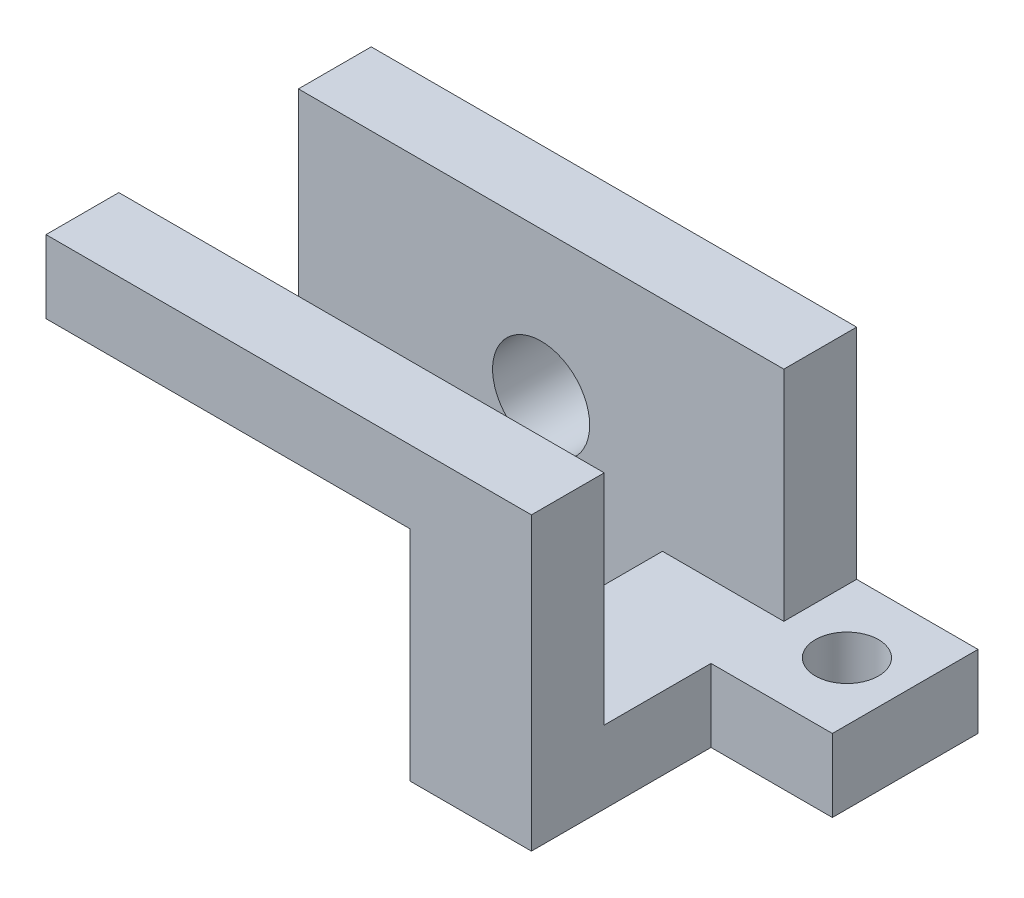
ISO-10303-21;
HEADER;
FILE_DESCRIPTION(('STEP AP214'),'2;1');
FILE_NAME('part.step','',(''),(''),'','','');
FILE_SCHEMA(('AUTOMOTIVE_DESIGN { 1 0 10303 214 1 1 1 1 }'));
ENDSEC;
DATA;
#1=APPLICATION_CONTEXT('core data for automotive mechanical design processes');
#2=APPLICATION_PROTOCOL_DEFINITION('international standard','automotive_design',2000,#1);
#3=PRODUCT_CONTEXT('',#1,'mechanical');
#4=PRODUCT('Part','Part','',(#3));
#5=PRODUCT_RELATED_PRODUCT_CATEGORY('part','',(#4));
#6=PRODUCT_DEFINITION_FORMATION('','',#4);
#7=PRODUCT_DEFINITION_CONTEXT('part definition',#1,'design');
#8=PRODUCT_DEFINITION('design','',#6,#7);
#9=PRODUCT_DEFINITION_SHAPE('','',#8);
#10=(LENGTH_UNIT() NAMED_UNIT(*) SI_UNIT(.MILLI.,.METRE.));
#11=(NAMED_UNIT(*) PLANE_ANGLE_UNIT() SI_UNIT($,.RADIAN.));
#12=(NAMED_UNIT(*) SI_UNIT($,.STERADIAN.) SOLID_ANGLE_UNIT());
#13=UNCERTAINTY_MEASURE_WITH_UNIT(LENGTH_MEASURE(1.E-05),#10,'distance_accuracy_value','');
#14=(GEOMETRIC_REPRESENTATION_CONTEXT(3) GLOBAL_UNCERTAINTY_ASSIGNED_CONTEXT((#13)) GLOBAL_UNIT_ASSIGNED_CONTEXT((#10,
#11,#12)) REPRESENTATION_CONTEXT('',''));
#15=CARTESIAN_POINT('',(0.,0.,0.));
#16=DIRECTION('',(0.,0.,1.));
#17=DIRECTION('',(1.,0.,0.));
#18=AXIS2_PLACEMENT_3D('',#15,#16,#17);
#19=CARTESIAN_POINT('',(50.,30.,-15.));
#20=DIRECTION('',(1.,0.,0.));
#21=DIRECTION('',(0.,1.,0.));
#22=AXIS2_PLACEMENT_3D('',#19,#20,#21);
#23=PLANE('',#22);
#24=DIRECTION('',(0.,0.,-1.));
#25=VECTOR('',#24,1.);
#26=CARTESIAN_POINT('',(50.,-15.,-15.));
#27=LINE('',#26,#25);
#28=CARTESIAN_POINT('',(50.,-15.,0.));
#29=VERTEX_POINT('',#28);
#30=CARTESIAN_POINT('',(50.,-15.,-15.));
#31=VERTEX_POINT('',#30);
#32=EDGE_CURVE('E60',#29,#31,#27,.T.);
#33=ORIENTED_EDGE('',*,*,#32,.T.);
#34=DIRECTION('',(0.,1.,0.));
#35=VECTOR('',#34,1.);
#36=CARTESIAN_POINT('',(50.,30.,-15.));
#37=LINE('',#36,#35);
#38=CARTESIAN_POINT('',(50.,30.,-15.));
#39=VERTEX_POINT('',#38);
#40=EDGE_CURVE('E254',#31,#39,#37,.T.);
#41=ORIENTED_EDGE('',*,*,#40,.T.);
#42=DIRECTION('',(0.,0.,1.));
#43=VECTOR('',#42,1.);
#44=CARTESIAN_POINT('',(50.,30.,-15.));
#45=LINE('',#44,#43);
#46=CARTESIAN_POINT('',(50.,30.,0.));
#47=VERTEX_POINT('',#46);
#48=EDGE_CURVE('E46',#39,#47,#45,.T.);
#49=ORIENTED_EDGE('',*,*,#48,.T.);
#50=DIRECTION('',(0.,1.,0.));
#51=VECTOR('',#50,1.);
#52=CARTESIAN_POINT('',(50.,30.,0.));
#53=LINE('',#52,#51);
#54=EDGE_CURVE('E250',#29,#47,#53,.T.);
#55=ORIENTED_EDGE('',*,*,#54,.F.);
#56=EDGE_LOOP('',(#33,#41,#49,#55));
#57=FACE_BOUND('',#56,.T.);
#58=ADVANCED_FACE('F43',(#57),#23,.T.);
#59=CARTESIAN_POINT('',(-50.,-30.,-15.));
#60=DIRECTION('',(0.,-1.,0.));
#61=DIRECTION('',(0.,0.,-1.));
#62=AXIS2_PLACEMENT_3D('',#59,#60,#61);
#63=PLANE('',#62);
#64=DIRECTION('',(1.,0.,0.));
#65=VECTOR('',#64,1.);
#66=CARTESIAN_POINT('',(-50.,-30.,0.));
#67=LINE('',#66,#65);
#68=CARTESIAN_POINT('',(-50.,-30.,0.));
#69=VERTEX_POINT('',#68);
#70=CARTESIAN_POINT('',(25.,-30.,0.));
#71=VERTEX_POINT('',#70);
#72=EDGE_CURVE('E258',#69,#71,#67,.T.);
#73=ORIENTED_EDGE('',*,*,#72,.F.);
#74=DIRECTION('',(0.,0.,1.));
#75=VECTOR('',#74,1.);
#76=CARTESIAN_POINT('',(-50.,-30.,-15.));
#77=LINE('',#76,#75);
#78=CARTESIAN_POINT('',(-50.,-30.,-15.));
#79=VERTEX_POINT('',#78);
#80=EDGE_CURVE('E11',#79,#69,#77,.T.);
#81=ORIENTED_EDGE('',*,*,#80,.F.);
#82=DIRECTION('',(1.,0.,0.));
#83=VECTOR('',#82,1.);
#84=CARTESIAN_POINT('',(-50.,-30.,-15.));
#85=LINE('',#84,#83);
#86=CARTESIAN_POINT('',(75.,-30.,-15.));
#87=VERTEX_POINT('',#86);
#88=EDGE_CURVE('E266',#79,#87,#85,.T.);
#89=ORIENTED_EDGE('',*,*,#88,.T.);
#90=DIRECTION('',(0.,0.,1.));
#91=VECTOR('',#90,1.);
#92=CARTESIAN_POINT('',(75.,-30.,15.));
#93=LINE('',#92,#91);
#94=CARTESIAN_POINT('',(75.,-30.,15.));
#95=VERTEX_POINT('',#94);
#96=EDGE_CURVE('E188',#87,#95,#93,.T.);
#97=ORIENTED_EDGE('',*,*,#96,.T.);
#98=DIRECTION('',(-1.,0.,0.));
#99=VECTOR('',#98,1.);
#100=CARTESIAN_POINT('',(50.,-30.,15.));
#101=LINE('',#100,#99);
#102=CARTESIAN_POINT('',(50.,-30.,15.));
#103=VERTEX_POINT('',#102);
#104=EDGE_CURVE('E224',#95,#103,#101,.T.);
#105=ORIENTED_EDGE('',*,*,#104,.T.);
#106=DIRECTION('',(0.,0.,1.));
#107=VECTOR('',#106,1.);
#108=CARTESIAN_POINT('',(50.,-30.,37.));
#109=LINE('',#108,#107);
#110=CARTESIAN_POINT('',(50.,-30.,52.));
#111=VERTEX_POINT('',#110);
#112=EDGE_CURVE('E228',#103,#111,#109,.T.);
#113=ORIENTED_EDGE('',*,*,#112,.T.);
#114=DIRECTION('',(1.,0.,0.));
#115=VECTOR('',#114,1.);
#116=CARTESIAN_POINT('',(25.,-30.,52.));
#117=LINE('',#116,#115);
#118=CARTESIAN_POINT('',(25.,-30.,52.));
#119=VERTEX_POINT('',#118);
#120=EDGE_CURVE('E320',#119,#111,#117,.T.);
#121=ORIENTED_EDGE('',*,*,#120,.F.);
#122=DIRECTION('',(0.,0.,-1.));
#123=VECTOR('',#122,1.);
#124=CARTESIAN_POINT('',(25.,-30.,0.));
#125=LINE('',#124,#123);
#126=EDGE_CURVE('E193',#119,#71,#125,.T.);
#127=ORIENTED_EDGE('',*,*,#126,.T.);
#128=EDGE_LOOP('',(#73,#81,#89,#97,#105,#113,#121,#127));
#129=FACE_BOUND('',#128,.T.);
#130=CARTESIAN_POINT('',(63.,-30.,0.));
#131=DIRECTION('',(0.,-1.,0.));
#132=DIRECTION('',(0.,0.,-1.));
#133=AXIS2_PLACEMENT_3D('',#130,#131,#132);
#134=CIRCLE('',#133,6.5);
#135=CARTESIAN_POINT('',(63.,-30.,-6.5));
#136=VERTEX_POINT('',#135);
#137=EDGE_CURVE('E175',#136,#136,#134,.T.);
#138=ORIENTED_EDGE('',*,*,#137,.F.);
#139=EDGE_LOOP('',(#138));
#140=FACE_BOUND('',#139,.T.);
#141=ADVANCED_FACE('F349',(#129,#140),#63,.T.);
#142=CARTESIAN_POINT('',(-50.,30.,-15.));
#143=DIRECTION('',(-1.,0.,0.));
#144=DIRECTION('',(0.,-1.,0.));
#145=AXIS2_PLACEMENT_3D('',#142,#143,#144);
#146=PLANE('',#145);
#147=DIRECTION('',(0.,-1.,0.));
#148=VECTOR('',#147,1.);
#149=CARTESIAN_POINT('',(-50.,30.,0.));
#150=LINE('',#149,#148);
#151=CARTESIAN_POINT('',(-50.,30.,0.));
#152=VERTEX_POINT('',#151);
#153=EDGE_CURVE('E275',#152,#69,#150,.T.);
#154=ORIENTED_EDGE('',*,*,#153,.F.);
#155=DIRECTION('',(0.,0.,1.));
#156=VECTOR('',#155,1.);
#157=CARTESIAN_POINT('',(-50.,30.,-15.));
#158=LINE('',#157,#156);
#159=CARTESIAN_POINT('',(-50.,30.,-15.));
#160=VERTEX_POINT('',#159);
#161=EDGE_CURVE('E52',#160,#152,#158,.T.);
#162=ORIENTED_EDGE('',*,*,#161,.F.);
#163=DIRECTION('',(0.,-1.,0.));
#164=VECTOR('',#163,1.);
#165=CARTESIAN_POINT('',(-50.,30.,-15.));
#166=LINE('',#165,#164);
#167=EDGE_CURVE('E262',#160,#79,#166,.T.);
#168=ORIENTED_EDGE('',*,*,#167,.T.);
#169=ORIENTED_EDGE('',*,*,#80,.T.);
#170=EDGE_LOOP('',(#154,#162,#168,#169));
#171=FACE_BOUND('',#170,.T.);
#172=ADVANCED_FACE('F353',(#171),#146,.T.);
#173=CARTESIAN_POINT('',(-50.,30.,-15.));
#174=DIRECTION('',(0.,1.,0.));
#175=DIRECTION('',(0.,0.,1.));
#176=AXIS2_PLACEMENT_3D('',#173,#174,#175);
#177=PLANE('',#176);
#178=DIRECTION('',(-1.,0.,0.));
#179=VECTOR('',#178,1.);
#180=CARTESIAN_POINT('',(-50.,30.,0.));
#181=LINE('',#180,#179);
#182=EDGE_CURVE('E271',#47,#152,#181,.T.);
#183=ORIENTED_EDGE('',*,*,#182,.F.);
#184=ORIENTED_EDGE('',*,*,#48,.F.);
#185=DIRECTION('',(-1.,0.,0.));
#186=VECTOR('',#185,1.);
#187=CARTESIAN_POINT('',(-50.,30.,-15.));
#188=LINE('',#187,#186);
#189=EDGE_CURVE('E257',#39,#160,#188,.T.);
#190=ORIENTED_EDGE('',*,*,#189,.T.);
#191=ORIENTED_EDGE('',*,*,#161,.T.);
#192=EDGE_LOOP('',(#183,#184,#190,#191));
#193=FACE_BOUND('',#192,.T.);
#194=ADVANCED_FACE('F288',(#193),#177,.T.);
#195=CARTESIAN_POINT('',(0.,0.,-15.));
#196=DIRECTION('',(0.,0.,1.));
#197=DIRECTION('',(1.,0.,0.));
#198=AXIS2_PLACEMENT_3D('',#195,#196,#197);
#199=PLANE('',#198);
#200=CARTESIAN_POINT('',(0.,0.,-15.));
#201=DIRECTION('',(0.,0.,1.));
#202=DIRECTION('',(1.,0.,0.));
#203=AXIS2_PLACEMENT_3D('',#200,#201,#202);
#204=CIRCLE('',#203,10.);
#205=CARTESIAN_POINT('',(9.99999999999999,0.,-15.));
#206=VERTEX_POINT('',#205);
#207=EDGE_CURVE('E246',#206,#206,#204,.T.);
#208=ORIENTED_EDGE('',*,*,#207,.T.);
#209=EDGE_LOOP('',(#208));
#210=FACE_BOUND('',#209,.T.);
#211=ORIENTED_EDGE('',*,*,#40,.F.);
#212=DIRECTION('',(1.,0.,0.));
#213=VECTOR('',#212,1.);
#214=CARTESIAN_POINT('',(75.,-15.,-15.));
#215=LINE('',#214,#213);
#216=CARTESIAN_POINT('',(75.,-15.,-15.));
#217=VERTEX_POINT('',#216);
#218=EDGE_CURVE('E196',#31,#217,#215,.T.);
#219=ORIENTED_EDGE('',*,*,#218,.T.);
#220=DIRECTION('',(0.,-1.,0.));
#221=VECTOR('',#220,1.);
#222=CARTESIAN_POINT('',(75.,-15.,-15.));
#223=LINE('',#222,#221);
#224=EDGE_CURVE('E220',#217,#87,#223,.T.);
#225=ORIENTED_EDGE('',*,*,#224,.T.);
#226=ORIENTED_EDGE('',*,*,#88,.F.);
#227=ORIENTED_EDGE('',*,*,#167,.F.);
#228=ORIENTED_EDGE('',*,*,#189,.F.);
#229=EDGE_LOOP('',(#211,#219,#225,#226,#227,#228));
#230=FACE_BOUND('',#229,.T.);
#231=ADVANCED_FACE('F365',(#210,#230),#199,.F.);
#232=CARTESIAN_POINT('',(0.,0.,0.));
#233=DIRECTION('',(0.,0.,1.));
#234=DIRECTION('',(1.,0.,0.));
#235=AXIS2_PLACEMENT_3D('',#232,#233,#234);
#236=PLANE('',#235);
#237=DIRECTION('',(0.,-1.,0.));
#238=VECTOR('',#237,1.);
#239=CARTESIAN_POINT('',(25.,-15.,0.));
#240=LINE('',#239,#238);
#241=CARTESIAN_POINT('',(25.,-15.,0.));
#242=VERTEX_POINT('',#241);
#243=EDGE_CURVE('E68',#242,#71,#240,.T.);
#244=ORIENTED_EDGE('',*,*,#243,.F.);
#245=DIRECTION('',(1.,0.,0.));
#246=VECTOR('',#245,1.);
#247=CARTESIAN_POINT('',(50.,-15.,0.));
#248=LINE('',#247,#246);
#249=EDGE_CURVE('E190',#242,#29,#248,.T.);
#250=ORIENTED_EDGE('',*,*,#249,.T.);
#251=ORIENTED_EDGE('',*,*,#54,.T.);
#252=ORIENTED_EDGE('',*,*,#182,.T.);
#253=ORIENTED_EDGE('',*,*,#153,.T.);
#254=ORIENTED_EDGE('',*,*,#72,.T.);
#255=EDGE_LOOP('',(#244,#250,#251,#252,#253,#254));
#256=FACE_BOUND('',#255,.T.);
#257=CARTESIAN_POINT('',(0.,0.,0.));
#258=DIRECTION('',(0.,0.,1.));
#259=DIRECTION('',(1.,0.,0.));
#260=AXIS2_PLACEMENT_3D('',#257,#258,#259);
#261=CIRCLE('',#260,10.);
#262=CARTESIAN_POINT('',(9.99999999999999,0.,0.));
#263=VERTEX_POINT('',#262);
#264=EDGE_CURVE('E236',#263,#263,#261,.T.);
#265=ORIENTED_EDGE('',*,*,#264,.F.);
#266=EDGE_LOOP('',(#265));
#267=FACE_BOUND('',#266,.T.);
#268=ADVANCED_FACE('F289',(#256,#267),#236,.T.);
#269=CARTESIAN_POINT('',(0.,0.,-15.));
#270=DIRECTION('',(0.,0.,1.));
#271=DIRECTION('',(1.,0.,0.));
#272=AXIS2_PLACEMENT_3D('',#269,#270,#271);
#273=CYLINDRICAL_SURFACE('',#272,10.);
#274=ORIENTED_EDGE('',*,*,#207,.F.);
#275=EDGE_LOOP('',(#274));
#276=FACE_BOUND('',#275,.T.);
#277=ORIENTED_EDGE('',*,*,#264,.T.);
#278=EDGE_LOOP('',(#277));
#279=FACE_BOUND('',#278,.T.);
#280=ADVANCED_FACE('F373',(#276,#279),#273,.F.);
#281=CARTESIAN_POINT('',(25.,-15.,0.));
#282=DIRECTION('',(-1.,0.,0.));
#283=DIRECTION('',(0.,0.,1.));
#284=AXIS2_PLACEMENT_3D('',#281,#282,#283);
#285=PLANE('',#284);
#286=ORIENTED_EDGE('',*,*,#126,.F.);
#287=DIRECTION('',(0.,-1.,0.));
#288=VECTOR('',#287,1.);
#289=CARTESIAN_POINT('',(25.,15.,52.));
#290=LINE('',#289,#288);
#291=CARTESIAN_POINT('',(25.,15.,52.));
#292=VERTEX_POINT('',#291);
#293=EDGE_CURVE('E323',#292,#119,#290,.T.);
#294=ORIENTED_EDGE('',*,*,#293,.F.);
#295=DIRECTION('',(0.,0.,-1.));
#296=VECTOR('',#295,1.);
#297=CARTESIAN_POINT('',(25.,15.,52.));
#298=LINE('',#297,#296);
#299=CARTESIAN_POINT('',(25.,15.,37.));
#300=VERTEX_POINT('',#299);
#301=EDGE_CURVE('E182',#292,#300,#298,.T.);
#302=ORIENTED_EDGE('',*,*,#301,.T.);
#303=DIRECTION('',(0.,-1.,0.));
#304=VECTOR('',#303,1.);
#305=CARTESIAN_POINT('',(25.,15.,37.));
#306=LINE('',#305,#304);
#307=CARTESIAN_POINT('',(25.,-15.,37.));
#308=VERTEX_POINT('',#307);
#309=EDGE_CURVE('E300',#300,#308,#306,.T.);
#310=ORIENTED_EDGE('',*,*,#309,.T.);
#311=DIRECTION('',(0.,0.,-1.));
#312=VECTOR('',#311,1.);
#313=CARTESIAN_POINT('',(25.,-15.,0.));
#314=LINE('',#313,#312);
#315=EDGE_CURVE('E216',#308,#242,#314,.T.);
#316=ORIENTED_EDGE('',*,*,#315,.T.);
#317=ORIENTED_EDGE('',*,*,#243,.T.);
#318=EDGE_LOOP('',(#286,#294,#302,#310,#316,#317));
#319=FACE_BOUND('',#318,.T.);
#320=ADVANCED_FACE('F297',(#319),#285,.T.);
#321=CARTESIAN_POINT('',(50.,-15.,37.));
#322=DIRECTION('',(1.,0.,0.));
#323=DIRECTION('',(0.,0.,-1.));
#324=AXIS2_PLACEMENT_3D('',#321,#322,#323);
#325=PLANE('',#324);
#326=ORIENTED_EDGE('',*,*,#112,.F.);
#327=DIRECTION('',(0.,-1.,0.));
#328=VECTOR('',#327,1.);
#329=CARTESIAN_POINT('',(50.,-15.,15.));
#330=LINE('',#329,#328);
#331=CARTESIAN_POINT('',(50.,-15.,15.));
#332=VERTEX_POINT('',#331);
#333=EDGE_CURVE('E237',#332,#103,#330,.T.);
#334=ORIENTED_EDGE('',*,*,#333,.F.);
#335=DIRECTION('',(0.,0.,1.));
#336=VECTOR('',#335,1.);
#337=CARTESIAN_POINT('',(50.,-15.,37.));
#338=LINE('',#337,#336);
#339=CARTESIAN_POINT('',(50.,-15.,37.));
#340=VERTEX_POINT('',#339);
#341=EDGE_CURVE('E208',#332,#340,#338,.T.);
#342=ORIENTED_EDGE('',*,*,#341,.T.);
#343=DIRECTION('',(0.,1.,0.));
#344=VECTOR('',#343,1.);
#345=CARTESIAN_POINT('',(50.,-30.,37.));
#346=LINE('',#345,#344);
#347=CARTESIAN_POINT('',(50.,30.,37.));
#348=VERTEX_POINT('',#347);
#349=EDGE_CURVE('E169',#340,#348,#346,.T.);
#350=ORIENTED_EDGE('',*,*,#349,.T.);
#351=DIRECTION('',(0.,0.,-1.));
#352=VECTOR('',#351,1.);
#353=CARTESIAN_POINT('',(50.,30.,52.));
#354=LINE('',#353,#352);
#355=CARTESIAN_POINT('',(50.,30.,52.));
#356=VERTEX_POINT('',#355);
#357=EDGE_CURVE('E315',#356,#348,#354,.T.);
#358=ORIENTED_EDGE('',*,*,#357,.F.);
#359=DIRECTION('',(0.,1.,0.));
#360=VECTOR('',#359,1.);
#361=CARTESIAN_POINT('',(50.,-30.,52.));
#362=LINE('',#361,#360);
#363=EDGE_CURVE('E164',#111,#356,#362,.T.);
#364=ORIENTED_EDGE('',*,*,#363,.F.);
#365=EDGE_LOOP('',(#326,#334,#342,#350,#358,#364));
#366=FACE_BOUND('',#365,.T.);
#367=ADVANCED_FACE('F386',(#366),#325,.T.);
#368=CARTESIAN_POINT('',(50.,-15.,15.));
#369=DIRECTION('',(0.,0.,1.));
#370=DIRECTION('',(1.,0.,0.));
#371=AXIS2_PLACEMENT_3D('',#368,#369,#370);
#372=PLANE('',#371);
#373=ORIENTED_EDGE('',*,*,#104,.F.);
#374=DIRECTION('',(0.,-1.,0.));
#375=VECTOR('',#374,1.);
#376=CARTESIAN_POINT('',(75.,-15.,15.));
#377=LINE('',#376,#375);
#378=CARTESIAN_POINT('',(75.,-15.,15.));
#379=VERTEX_POINT('',#378);
#380=EDGE_CURVE('E240',#379,#95,#377,.T.);
#381=ORIENTED_EDGE('',*,*,#380,.F.);
#382=DIRECTION('',(-1.,0.,0.));
#383=VECTOR('',#382,1.);
#384=CARTESIAN_POINT('',(50.,-15.,15.));
#385=LINE('',#384,#383);
#386=EDGE_CURVE('E204',#379,#332,#385,.T.);
#387=ORIENTED_EDGE('',*,*,#386,.T.);
#388=ORIENTED_EDGE('',*,*,#333,.T.);
#389=EDGE_LOOP('',(#373,#381,#387,#388));
#390=FACE_BOUND('',#389,.T.);
#391=ADVANCED_FACE('F382',(#390),#372,.T.);
#392=CARTESIAN_POINT('',(75.,-15.,15.));
#393=DIRECTION('',(1.,0.,0.));
#394=DIRECTION('',(0.,0.,-1.));
#395=AXIS2_PLACEMENT_3D('',#392,#393,#394);
#396=PLANE('',#395);
#397=ORIENTED_EDGE('',*,*,#96,.F.);
#398=ORIENTED_EDGE('',*,*,#224,.F.);
#399=DIRECTION('',(0.,0.,1.));
#400=VECTOR('',#399,1.);
#401=CARTESIAN_POINT('',(75.,-15.,15.));
#402=LINE('',#401,#400);
#403=EDGE_CURVE('E200',#217,#379,#402,.T.);
#404=ORIENTED_EDGE('',*,*,#403,.T.);
#405=ORIENTED_EDGE('',*,*,#380,.T.);
#406=EDGE_LOOP('',(#397,#398,#404,#405));
#407=FACE_BOUND('',#406,.T.);
#408=ADVANCED_FACE('F379',(#407),#396,.T.);
#409=CARTESIAN_POINT('',(0.,-15.,0.));
#410=DIRECTION('',(0.,1.,0.));
#411=DIRECTION('',(0.,0.,1.));
#412=AXIS2_PLACEMENT_3D('',#409,#410,#411);
#413=PLANE('',#412);
#414=CARTESIAN_POINT('',(63.,-15.,0.));
#415=DIRECTION('',(0.,-1.,0.));
#416=DIRECTION('',(0.,0.,-1.));
#417=AXIS2_PLACEMENT_3D('',#414,#415,#416);
#418=CIRCLE('',#417,6.5);
#419=CARTESIAN_POINT('',(63.,-15.,-6.5));
#420=VERTEX_POINT('',#419);
#421=EDGE_CURVE('E180',#420,#420,#418,.T.);
#422=ORIENTED_EDGE('',*,*,#421,.T.);
#423=EDGE_LOOP('',(#422));
#424=FACE_BOUND('',#423,.T.);
#425=ORIENTED_EDGE('',*,*,#249,.F.);
#426=ORIENTED_EDGE('',*,*,#315,.F.);
#427=DIRECTION('',(-1.,0.,0.));
#428=VECTOR('',#427,1.);
#429=CARTESIAN_POINT('',(25.,-15.,37.));
#430=LINE('',#429,#428);
#431=EDGE_CURVE('E212',#340,#308,#430,.T.);
#432=ORIENTED_EDGE('',*,*,#431,.F.);
#433=ORIENTED_EDGE('',*,*,#341,.F.);
#434=ORIENTED_EDGE('',*,*,#386,.F.);
#435=ORIENTED_EDGE('',*,*,#403,.F.);
#436=ORIENTED_EDGE('',*,*,#218,.F.);
#437=ORIENTED_EDGE('',*,*,#32,.F.);
#438=EDGE_LOOP('',(#425,#426,#432,#433,#434,#435,#436,#437));
#439=FACE_BOUND('',#438,.T.);
#440=ADVANCED_FACE('F293',(#424,#439),#413,.T.);
#441=CARTESIAN_POINT('',(63.,-15.,0.));
#442=DIRECTION('',(0.,-1.,0.));
#443=DIRECTION('',(0.,0.,-1.));
#444=AXIS2_PLACEMENT_3D('',#441,#442,#443);
#445=CYLINDRICAL_SURFACE('',#444,6.5);
#446=ORIENTED_EDGE('',*,*,#421,.F.);
#447=EDGE_LOOP('',(#446));
#448=FACE_BOUND('',#447,.T.);
#449=ORIENTED_EDGE('',*,*,#137,.T.);
#450=EDGE_LOOP('',(#449));
#451=FACE_BOUND('',#450,.T.);
#452=ADVANCED_FACE('F337',(#448,#451),#445,.F.);
#453=CARTESIAN_POINT('',(0.,0.,37.));
#454=DIRECTION('',(0.,0.,1.));
#455=DIRECTION('',(1.,0.,0.));
#456=AXIS2_PLACEMENT_3D('',#453,#454,#455);
#457=PLANE('',#456);
#458=ORIENTED_EDGE('',*,*,#349,.F.);
#459=ORIENTED_EDGE('',*,*,#431,.T.);
#460=ORIENTED_EDGE('',*,*,#309,.F.);
#461=DIRECTION('',(1.,0.,0.));
#462=VECTOR('',#461,1.);
#463=CARTESIAN_POINT('',(-50.,15.,37.));
#464=LINE('',#463,#462);
#465=CARTESIAN_POINT('',(-50.,15.,37.));
#466=VERTEX_POINT('',#465);
#467=EDGE_CURVE('E306',#466,#300,#464,.T.);
#468=ORIENTED_EDGE('',*,*,#467,.F.);
#469=DIRECTION('',(0.,-1.,0.));
#470=VECTOR('',#469,1.);
#471=CARTESIAN_POINT('',(-50.,30.,37.));
#472=LINE('',#471,#470);
#473=CARTESIAN_POINT('',(-50.,30.,37.));
#474=VERTEX_POINT('',#473);
#475=EDGE_CURVE('E311',#474,#466,#472,.T.);
#476=ORIENTED_EDGE('',*,*,#475,.F.);
#477=DIRECTION('',(-1.,0.,0.));
#478=VECTOR('',#477,1.);
#479=CARTESIAN_POINT('',(50.,30.,37.));
#480=LINE('',#479,#478);
#481=EDGE_CURVE('E173',#348,#474,#480,.T.);
#482=ORIENTED_EDGE('',*,*,#481,.F.);
#483=EDGE_LOOP('',(#458,#459,#460,#468,#476,#482));
#484=FACE_BOUND('',#483,.T.);
#485=ADVANCED_FACE('F335',(#484),#457,.F.);
#486=CARTESIAN_POINT('',(50.,30.,52.));
#487=DIRECTION('',(0.,-1.,0.));
#488=DIRECTION('',(0.,0.,-1.));
#489=AXIS2_PLACEMENT_3D('',#486,#487,#488);
#490=PLANE('',#489);
#491=ORIENTED_EDGE('',*,*,#481,.T.);
#492=DIRECTION('',(0.,0.,-1.));
#493=VECTOR('',#492,1.);
#494=CARTESIAN_POINT('',(-50.,30.,52.));
#495=LINE('',#494,#493);
#496=CARTESIAN_POINT('',(-50.,30.,52.));
#497=VERTEX_POINT('',#496);
#498=EDGE_CURVE('E150',#497,#474,#495,.T.);
#499=ORIENTED_EDGE('',*,*,#498,.F.);
#500=DIRECTION('',(-1.,0.,0.));
#501=VECTOR('',#500,1.);
#502=CARTESIAN_POINT('',(50.,30.,52.));
#503=LINE('',#502,#501);
#504=EDGE_CURVE('E158',#356,#497,#503,.T.);
#505=ORIENTED_EDGE('',*,*,#504,.F.);
#506=ORIENTED_EDGE('',*,*,#357,.T.);
#507=EDGE_LOOP('',(#491,#499,#505,#506));
#508=FACE_BOUND('',#507,.T.);
#509=ADVANCED_FACE('F171',(#508),#490,.F.);
#510=CARTESIAN_POINT('',(-50.,30.,52.));
#511=DIRECTION('',(1.,0.,0.));
#512=DIRECTION('',(0.,0.,-1.));
#513=AXIS2_PLACEMENT_3D('',#510,#511,#512);
#514=PLANE('',#513);
#515=ORIENTED_EDGE('',*,*,#475,.T.);
#516=DIRECTION('',(0.,0.,-1.));
#517=VECTOR('',#516,1.);
#518=CARTESIAN_POINT('',(-50.,15.,52.));
#519=LINE('',#518,#517);
#520=CARTESIAN_POINT('',(-50.,15.,52.));
#521=VERTEX_POINT('',#520);
#522=EDGE_CURVE('E153',#521,#466,#519,.T.);
#523=ORIENTED_EDGE('',*,*,#522,.F.);
#524=DIRECTION('',(0.,-1.,0.));
#525=VECTOR('',#524,1.);
#526=CARTESIAN_POINT('',(-50.,30.,52.));
#527=LINE('',#526,#525);
#528=EDGE_CURVE('E146',#497,#521,#527,.T.);
#529=ORIENTED_EDGE('',*,*,#528,.F.);
#530=ORIENTED_EDGE('',*,*,#498,.T.);
#531=EDGE_LOOP('',(#515,#523,#529,#530));
#532=FACE_BOUND('',#531,.T.);
#533=ADVANCED_FACE('F148',(#532),#514,.F.);
#534=CARTESIAN_POINT('',(-50.,15.,52.));
#535=DIRECTION('',(0.,1.,0.));
#536=DIRECTION('',(0.,0.,1.));
#537=AXIS2_PLACEMENT_3D('',#534,#535,#536);
#538=PLANE('',#537);
#539=ORIENTED_EDGE('',*,*,#467,.T.);
#540=ORIENTED_EDGE('',*,*,#301,.F.);
#541=DIRECTION('',(1.,0.,0.));
#542=VECTOR('',#541,1.);
#543=CARTESIAN_POINT('',(-50.,15.,52.));
#544=LINE('',#543,#542);
#545=EDGE_CURVE('E157',#521,#292,#544,.T.);
#546=ORIENTED_EDGE('',*,*,#545,.F.);
#547=ORIENTED_EDGE('',*,*,#522,.T.);
#548=EDGE_LOOP('',(#539,#540,#546,#547));
#549=FACE_BOUND('',#548,.T.);
#550=ADVANCED_FACE('F333',(#549),#538,.F.);
#551=CARTESIAN_POINT('',(0.,0.,52.));
#552=DIRECTION('',(0.,0.,1.));
#553=DIRECTION('',(1.,0.,0.));
#554=AXIS2_PLACEMENT_3D('',#551,#552,#553);
#555=PLANE('',#554);
#556=ORIENTED_EDGE('',*,*,#504,.T.);
#557=ORIENTED_EDGE('',*,*,#528,.T.);
#558=ORIENTED_EDGE('',*,*,#545,.T.);
#559=ORIENTED_EDGE('',*,*,#293,.T.);
#560=ORIENTED_EDGE('',*,*,#120,.T.);
#561=ORIENTED_EDGE('',*,*,#363,.T.);
#562=EDGE_LOOP('',(#556,#557,#558,#559,#560,#561));
#563=FACE_BOUND('',#562,.T.);
#564=ADVANCED_FACE('F161',(#563),#555,.T.);
#565=CLOSED_SHELL('',(#58,#141,#172,#194,#231,#268,#280,#320,#367,#391,#408,#440,#452,#485,#509,
#533,#550,#564));
#566=MANIFOLD_SOLID_BREP('B2',#565);
#567=ADVANCED_BREP_SHAPE_REPRESENTATION('',(#18,#566),#14);
#568=SHAPE_DEFINITION_REPRESENTATION(#9,#567);
ENDSEC;
END-ISO-10303-21;
